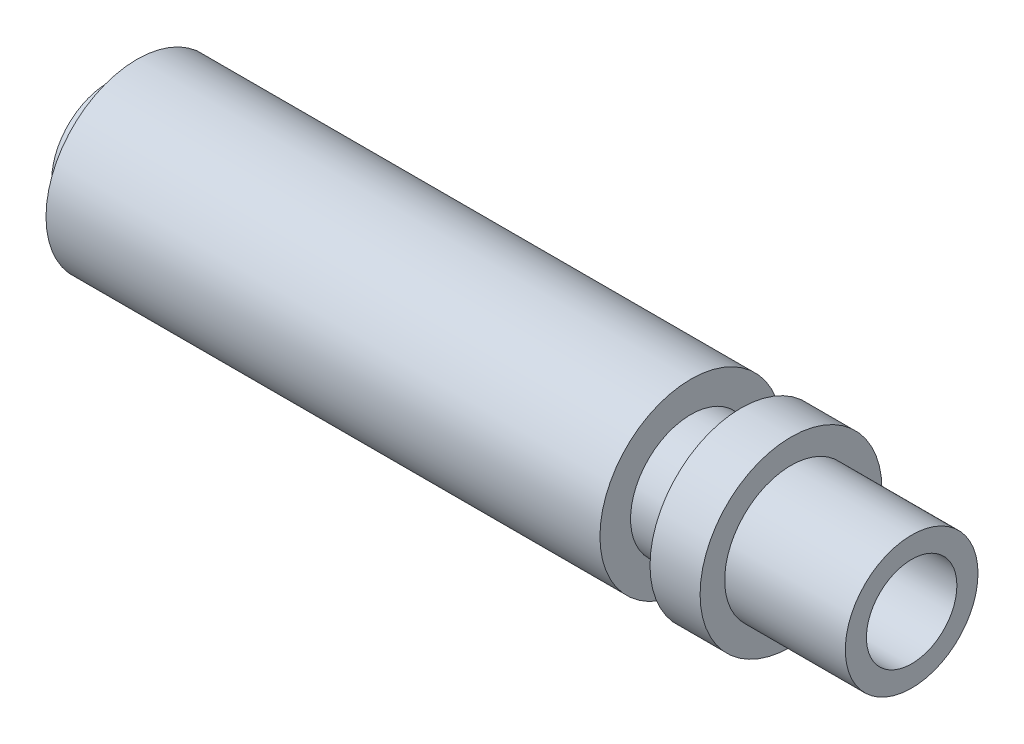
ISO-10303-21;
HEADER;
FILE_DESCRIPTION(('STEP AP214'),'2;1');
FILE_NAME('part.step','',(''),(''),'','','');
FILE_SCHEMA(('AUTOMOTIVE_DESIGN { 1 0 10303 214 1 1 1 1 }'));
ENDSEC;
DATA;
#1=APPLICATION_CONTEXT('core data for automotive mechanical design processes');
#2=APPLICATION_PROTOCOL_DEFINITION('international standard','automotive_design',2000,#1);
#3=PRODUCT_CONTEXT('',#1,'mechanical');
#4=PRODUCT('Part','Part','',(#3));
#5=PRODUCT_RELATED_PRODUCT_CATEGORY('part','',(#4));
#6=PRODUCT_DEFINITION_FORMATION('','',#4);
#7=PRODUCT_DEFINITION_CONTEXT('part definition',#1,'design');
#8=PRODUCT_DEFINITION('design','',#6,#7);
#9=PRODUCT_DEFINITION_SHAPE('','',#8);
#10=(LENGTH_UNIT() NAMED_UNIT(*) SI_UNIT(.MILLI.,.METRE.));
#11=(NAMED_UNIT(*) PLANE_ANGLE_UNIT() SI_UNIT($,.RADIAN.));
#12=(NAMED_UNIT(*) SI_UNIT($,.STERADIAN.) SOLID_ANGLE_UNIT());
#13=UNCERTAINTY_MEASURE_WITH_UNIT(LENGTH_MEASURE(1.E-05),#10,'distance_accuracy_value','');
#14=(GEOMETRIC_REPRESENTATION_CONTEXT(3) GLOBAL_UNCERTAINTY_ASSIGNED_CONTEXT((#13)) GLOBAL_UNIT_ASSIGNED_CONTEXT((#10,
#11,#12)) REPRESENTATION_CONTEXT('',''));
#15=CARTESIAN_POINT('',(0.,0.,0.));
#16=DIRECTION('',(0.,0.,1.));
#17=DIRECTION('',(1.,0.,0.));
#18=AXIS2_PLACEMENT_3D('',#15,#16,#17);
#19=CARTESIAN_POINT('',(108.4446395,0.,0.));
#20=DIRECTION('',(-1.,0.,0.));
#21=DIRECTION('',(0.,0.,1.));
#22=AXIS2_PLACEMENT_3D('',#19,#20,#21);
#23=CYLINDRICAL_SURFACE('',#22,15.07617);
#24=CARTESIAN_POINT('',(0.,0.,0.));
#25=DIRECTION('',(1.,0.,0.));
#26=DIRECTION('',(0.,0.,-1.));
#27=AXIS2_PLACEMENT_3D('',#24,#25,#26);
#28=CIRCLE('',#27,15.07617);
#29=CARTESIAN_POINT('',(0.,0.,-15.07617));
#30=VERTEX_POINT('',#29);
#31=EDGE_CURVE('E42',#30,#30,#28,.T.);
#32=ORIENTED_EDGE('',*,*,#31,.T.);
#33=EDGE_LOOP('',(#32));
#34=FACE_BOUND('',#33,.T.);
#35=CARTESIAN_POINT('',(91.8398667,0.,0.));
#36=DIRECTION('',(1.,0.,0.));
#37=DIRECTION('',(0.,0.,-1.));
#38=AXIS2_PLACEMENT_3D('',#35,#36,#37);
#39=CIRCLE('',#38,15.07617);
#40=CARTESIAN_POINT('',(91.8398667,0.,-15.07617));
#41=VERTEX_POINT('',#40);
#42=EDGE_CURVE('E69',#41,#41,#39,.T.);
#43=ORIENTED_EDGE('',*,*,#42,.F.);
#44=EDGE_LOOP('',(#43));
#45=FACE_BOUND('',#44,.T.);
#46=ADVANCED_FACE('F31',(#34,#45),#23,.T.);
#47=CARTESIAN_POINT('',(0.,0.,0.));
#48=DIRECTION('',(1.,0.,0.));
#49=DIRECTION('',(0.,0.,-1.));
#50=AXIS2_PLACEMENT_3D('',#47,#48,#49);
#51=PLANE('',#50);
#52=CARTESIAN_POINT('',(0.,0.,0.));
#53=DIRECTION('',(1.,0.,0.));
#54=DIRECTION('',(0.,0.,-1.));
#55=AXIS2_PLACEMENT_3D('',#52,#53,#54);
#56=CIRCLE('',#55,9.3853);
#57=CARTESIAN_POINT('',(0.,0.,-9.3853));
#58=VERTEX_POINT('',#57);
#59=EDGE_CURVE('E10',#58,#58,#56,.F.);
#60=ORIENTED_EDGE('',*,*,#59,.F.);
#61=EDGE_LOOP('',(#60));
#62=FACE_BOUND('',#61,.T.);
#63=ORIENTED_EDGE('',*,*,#31,.F.);
#64=EDGE_LOOP('',(#63));
#65=FACE_BOUND('',#64,.T.);
#66=ADVANCED_FACE('F94',(#62,#65),#51,.F.);
#67=CARTESIAN_POINT('',(-4.7498,0.,0.));
#68=DIRECTION('',(-1.,0.,0.));
#69=DIRECTION('',(0.,0.,1.));
#70=AXIS2_PLACEMENT_3D('',#67,#68,#69);
#71=PLANE('',#70);
#72=CARTESIAN_POINT('',(-4.7498,0.,0.));
#73=DIRECTION('',(-1.,0.,0.));
#74=DIRECTION('',(0.,0.,1.));
#75=AXIS2_PLACEMENT_3D('',#72,#73,#74);
#76=CIRCLE('',#75,9.3853);
#77=CARTESIAN_POINT('',(-4.7498,0.,9.3853));
#78=VERTEX_POINT('',#77);
#79=EDGE_CURVE('E47',#78,#78,#76,.T.);
#80=ORIENTED_EDGE('',*,*,#79,.T.);
#81=EDGE_LOOP('',(#80));
#82=FACE_BOUND('',#81,.T.);
#83=CARTESIAN_POINT('',(-4.7498,0.,0.));
#84=DIRECTION('',(-1.,0.,0.));
#85=DIRECTION('',(0.,0.,1.));
#86=AXIS2_PLACEMENT_3D('',#83,#84,#85);
#87=CIRCLE('',#86,4.5847);
#88=CARTESIAN_POINT('',(-4.7498,0.,4.5847));
#89=VERTEX_POINT('',#88);
#90=EDGE_CURVE('E51',#89,#89,#87,.T.);
#91=ORIENTED_EDGE('',*,*,#90,.F.);
#92=EDGE_LOOP('',(#91));
#93=FACE_BOUND('',#92,.T.);
#94=ADVANCED_FACE('F101',(#82,#93),#71,.T.);
#95=CARTESIAN_POINT('',(-4.7498,0.,0.));
#96=DIRECTION('',(1.,0.,0.));
#97=DIRECTION('',(0.,0.,-1.));
#98=AXIS2_PLACEMENT_3D('',#95,#96,#97);
#99=CYLINDRICAL_SURFACE('',#98,9.3853);
#100=ORIENTED_EDGE('',*,*,#79,.F.);
#101=EDGE_LOOP('',(#100));
#102=FACE_BOUND('',#101,.T.);
#103=ORIENTED_EDGE('',*,*,#59,.T.);
#104=EDGE_LOOP('',(#103));
#105=FACE_BOUND('',#104,.T.);
#106=ADVANCED_FACE('F141',(#102,#105),#99,.T.);
#107=CARTESIAN_POINT('',(-4.7498,0.,0.));
#108=DIRECTION('',(1.,0.,0.));
#109=DIRECTION('',(0.,0.,-1.));
#110=AXIS2_PLACEMENT_3D('',#107,#108,#109);
#111=CYLINDRICAL_SURFACE('',#110,4.5847);
#112=ORIENTED_EDGE('',*,*,#90,.T.);
#113=EDGE_LOOP('',(#112));
#114=FACE_BOUND('',#113,.T.);
#115=CARTESIAN_POINT('',(0.,0.,0.));
#116=DIRECTION('',(-1.,0.,0.));
#117=DIRECTION('',(0.,0.,1.));
#118=AXIS2_PLACEMENT_3D('',#115,#116,#117);
#119=CIRCLE('',#118,4.5847);
#120=CARTESIAN_POINT('',(0.,0.,4.5847));
#121=VERTEX_POINT('',#120);
#122=EDGE_CURVE('E52',#121,#121,#119,.T.);
#123=ORIENTED_EDGE('',*,*,#122,.F.);
#124=EDGE_LOOP('',(#123));
#125=FACE_BOUND('',#124,.T.);
#126=ADVANCED_FACE('F138',(#114,#125),#111,.F.);
#127=ORIENTED_EDGE('',*,*,#122,.T.);
#128=EDGE_LOOP('',(#127));
#129=FACE_BOUND('',#128,.T.);
#130=ADVANCED_FACE('F89',(#129),#51,.F.);
#131=CARTESIAN_POINT('',(91.8398667,0.,0.));
#132=DIRECTION('',(1.,0.,0.));
#133=DIRECTION('',(0.,0.,-1.));
#134=AXIS2_PLACEMENT_3D('',#131,#132,#133);
#135=PLANE('',#134);
#136=CARTESIAN_POINT('',(91.8398667,0.,0.));
#137=DIRECTION('',(1.,0.,0.));
#138=DIRECTION('',(0.,0.,-1.));
#139=AXIS2_PLACEMENT_3D('',#136,#137,#138);
#140=CIRCLE('',#139,10.);
#141=CARTESIAN_POINT('',(91.8398667,0.,-10.));
#142=VERTEX_POINT('',#141);
#143=EDGE_CURVE('E73',#142,#142,#140,.T.);
#144=ORIENTED_EDGE('',*,*,#143,.F.);
#145=EDGE_LOOP('',(#144));
#146=FACE_BOUND('',#145,.T.);
#147=ORIENTED_EDGE('',*,*,#42,.T.);
#148=EDGE_LOOP('',(#147));
#149=FACE_BOUND('',#148,.T.);
#150=ADVANCED_FACE('F85',(#146,#149),#135,.T.);
#151=CARTESIAN_POINT('',(100.1422531,0.,0.));
#152=DIRECTION('',(1.,0.,0.));
#153=DIRECTION('',(0.,0.,-1.));
#154=AXIS2_PLACEMENT_3D('',#151,#152,#153);
#155=PLANE('',#154);
#156=CARTESIAN_POINT('',(100.1422531,0.,0.));
#157=DIRECTION('',(1.,0.,0.));
#158=DIRECTION('',(0.,0.,-1.));
#159=AXIS2_PLACEMENT_3D('',#156,#157,#158);
#160=CIRCLE('',#159,10.);
#161=CARTESIAN_POINT('',(100.1422531,0.,-10.));
#162=VERTEX_POINT('',#161);
#163=EDGE_CURVE('E76',#162,#162,#160,.T.);
#164=ORIENTED_EDGE('',*,*,#163,.T.);
#165=EDGE_LOOP('',(#164));
#166=FACE_BOUND('',#165,.T.);
#167=CARTESIAN_POINT('',(100.1422531,0.,0.));
#168=DIRECTION('',(1.,0.,0.));
#169=DIRECTION('',(0.,0.,-1.));
#170=AXIS2_PLACEMENT_3D('',#167,#168,#169);
#171=CIRCLE('',#170,15.07617);
#172=CARTESIAN_POINT('',(100.1422531,0.,-15.07617));
#173=VERTEX_POINT('',#172);
#174=EDGE_CURVE('E70',#173,#173,#171,.T.);
#175=ORIENTED_EDGE('',*,*,#174,.F.);
#176=EDGE_LOOP('',(#175));
#177=FACE_BOUND('',#176,.T.);
#178=ADVANCED_FACE('F88',(#166,#177),#155,.F.);
#179=CARTESIAN_POINT('',(91.8398667,0.,0.));
#180=DIRECTION('',(1.,0.,0.));
#181=DIRECTION('',(0.,0.,-1.));
#182=AXIS2_PLACEMENT_3D('',#179,#180,#181);
#183=CYLINDRICAL_SURFACE('',#182,10.);
#184=ORIENTED_EDGE('',*,*,#143,.T.);
#185=EDGE_LOOP('',(#184));
#186=FACE_BOUND('',#185,.T.);
#187=ORIENTED_EDGE('',*,*,#163,.F.);
#188=EDGE_LOOP('',(#187));
#189=FACE_BOUND('',#188,.T.);
#190=ADVANCED_FACE('F82',(#186,#189),#183,.T.);
#191=CARTESIAN_POINT('',(89.6946395,0.,0.));
#192=DIRECTION('',(1.,0.,0.));
#193=DIRECTION('',(0.,0.,-1.));
#194=AXIS2_PLACEMENT_3D('',#191,#192,#193);
#195=PLANE('',#194);
#196=CARTESIAN_POINT('',(89.6946395,0.,0.));
#197=DIRECTION('',(1.,0.,0.));
#198=DIRECTION('',(0.,0.,-1.));
#199=AXIS2_PLACEMENT_3D('',#196,#197,#198);
#200=CIRCLE('',#199,7.5);
#201=CARTESIAN_POINT('',(89.6946395,0.,-7.5));
#202=VERTEX_POINT('',#201);
#203=EDGE_CURVE('E55',#202,#202,#200,.T.);
#204=ORIENTED_EDGE('',*,*,#203,.T.);
#205=EDGE_LOOP('',(#204));
#206=FACE_BOUND('',#205,.T.);
#207=ADVANCED_FACE('F121',(#206),#195,.T.);
#208=CARTESIAN_POINT('',(89.6946395,0.,0.));
#209=DIRECTION('',(1.,0.,0.));
#210=DIRECTION('',(0.,0.,-1.));
#211=AXIS2_PLACEMENT_3D('',#208,#209,#210);
#212=CYLINDRICAL_SURFACE('',#211,7.5);
#213=ORIENTED_EDGE('',*,*,#203,.F.);
#214=EDGE_LOOP('',(#213));
#215=FACE_BOUND('',#214,.T.);
#216=CARTESIAN_POINT('',(128.4446395,0.,0.));
#217=DIRECTION('',(1.,0.,0.));
#218=DIRECTION('',(0.,0.,-1.));
#219=AXIS2_PLACEMENT_3D('',#216,#217,#218);
#220=CIRCLE('',#219,7.5);
#221=CARTESIAN_POINT('',(128.4446395,0.,-7.5));
#222=VERTEX_POINT('',#221);
#223=EDGE_CURVE('E64',#222,#222,#220,.T.);
#224=ORIENTED_EDGE('',*,*,#223,.T.);
#225=EDGE_LOOP('',(#224));
#226=FACE_BOUND('',#225,.T.);
#227=ADVANCED_FACE('F127',(#215,#226),#212,.F.);
#228=CARTESIAN_POINT('',(128.4446395,0.,0.));
#229=DIRECTION('',(1.,0.,0.));
#230=DIRECTION('',(0.,0.,-1.));
#231=AXIS2_PLACEMENT_3D('',#228,#229,#230);
#232=PLANE('',#231);
#233=CARTESIAN_POINT('',(128.4446395,0.,0.));
#234=DIRECTION('',(1.,0.,0.));
#235=DIRECTION('',(0.,0.,-1.));
#236=AXIS2_PLACEMENT_3D('',#233,#234,#235);
#237=CIRCLE('',#236,11.);
#238=CARTESIAN_POINT('',(128.4446395,0.,-11.));
#239=VERTEX_POINT('',#238);
#240=EDGE_CURVE('E60',#239,#239,#237,.T.);
#241=ORIENTED_EDGE('',*,*,#240,.T.);
#242=EDGE_LOOP('',(#241));
#243=FACE_BOUND('',#242,.T.);
#244=ORIENTED_EDGE('',*,*,#223,.F.);
#245=EDGE_LOOP('',(#244));
#246=FACE_BOUND('',#245,.T.);
#247=ADVANCED_FACE('F124',(#243,#246),#232,.T.);
#248=CARTESIAN_POINT('',(128.4446395,0.,0.));
#249=DIRECTION('',(-1.,0.,0.));
#250=DIRECTION('',(0.,0.,1.));
#251=AXIS2_PLACEMENT_3D('',#248,#249,#250);
#252=CYLINDRICAL_SURFACE('',#251,11.);
#253=ORIENTED_EDGE('',*,*,#240,.F.);
#254=EDGE_LOOP('',(#253));
#255=FACE_BOUND('',#254,.T.);
#256=CARTESIAN_POINT('',(108.4446395,0.,0.));
#257=DIRECTION('',(1.,0.,0.));
#258=DIRECTION('',(0.,0.,-1.));
#259=AXIS2_PLACEMENT_3D('',#256,#257,#258);
#260=CIRCLE('',#259,11.);
#261=CARTESIAN_POINT('',(108.4446395,0.,-11.));
#262=VERTEX_POINT('',#261);
#263=EDGE_CURVE('E61',#262,#262,#260,.T.);
#264=ORIENTED_EDGE('',*,*,#263,.T.);
#265=EDGE_LOOP('',(#264));
#266=FACE_BOUND('',#265,.T.);
#267=ADVANCED_FACE('F110',(#255,#266),#252,.T.);
#268=CARTESIAN_POINT('',(108.4446395,0.,0.));
#269=DIRECTION('',(1.,0.,0.));
#270=DIRECTION('',(0.,0.,-1.));
#271=AXIS2_PLACEMENT_3D('',#268,#269,#270);
#272=PLANE('',#271);
#273=CARTESIAN_POINT('',(108.4446395,0.,0.));
#274=DIRECTION('',(1.,0.,0.));
#275=DIRECTION('',(0.,0.,-1.));
#276=AXIS2_PLACEMENT_3D('',#273,#274,#275);
#277=CIRCLE('',#276,15.07617);
#278=CARTESIAN_POINT('',(108.4446395,0.,-15.07617));
#279=VERTEX_POINT('',#278);
#280=EDGE_CURVE('E38',#279,#279,#277,.T.);
#281=ORIENTED_EDGE('',*,*,#280,.T.);
#282=EDGE_LOOP('',(#281));
#283=FACE_BOUND('',#282,.T.);
#284=ORIENTED_EDGE('',*,*,#263,.F.);
#285=EDGE_LOOP('',(#284));
#286=FACE_BOUND('',#285,.T.);
#287=ADVANCED_FACE('F104',(#283,#286),#272,.T.);
#288=ORIENTED_EDGE('',*,*,#174,.T.);
#289=EDGE_LOOP('',(#288));
#290=FACE_BOUND('',#289,.T.);
#291=ORIENTED_EDGE('',*,*,#280,.F.);
#292=EDGE_LOOP('',(#291));
#293=FACE_BOUND('',#292,.T.);
#294=ADVANCED_FACE('F33',(#290,#293),#23,.T.);
#295=CLOSED_SHELL('',(#46,#66,#94,#106,#126,#130,#150,#178,#190,#207,#227,#247,#267,#287,#294));
#296=MANIFOLD_SOLID_BREP('B2',#295);
#297=ADVANCED_BREP_SHAPE_REPRESENTATION('',(#18,#296),#14);
#298=SHAPE_DEFINITION_REPRESENTATION(#9,#297);
ENDSEC;
END-ISO-10303-21;
